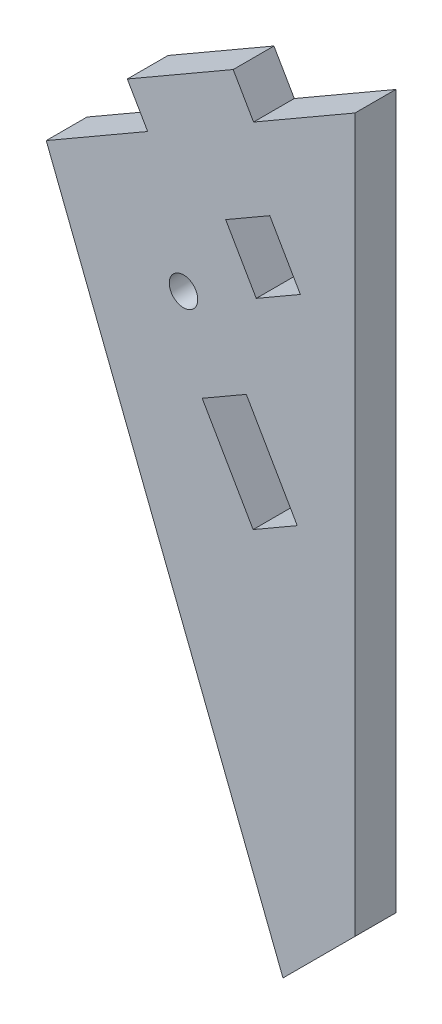
ISO-10303-21;
HEADER;
FILE_DESCRIPTION(('STEP AP214'),'2;1');
FILE_NAME('part.step','',(''),(''),'','','');
FILE_SCHEMA(('AUTOMOTIVE_DESIGN { 1 0 10303 214 1 1 1 1 }'));
ENDSEC;
DATA;
#1=APPLICATION_CONTEXT('core data for automotive mechanical design processes');
#2=APPLICATION_PROTOCOL_DEFINITION('international standard','automotive_design',2000,#1);
#3=PRODUCT_CONTEXT('',#1,'mechanical');
#4=PRODUCT('Part','Part','',(#3));
#5=PRODUCT_RELATED_PRODUCT_CATEGORY('part','',(#4));
#6=PRODUCT_DEFINITION_FORMATION('','',#4);
#7=PRODUCT_DEFINITION_CONTEXT('part definition',#1,'design');
#8=PRODUCT_DEFINITION('design','',#6,#7);
#9=PRODUCT_DEFINITION_SHAPE('','',#8);
#10=(LENGTH_UNIT() NAMED_UNIT(*) SI_UNIT(.MILLI.,.METRE.));
#11=(NAMED_UNIT(*) PLANE_ANGLE_UNIT() SI_UNIT($,.RADIAN.));
#12=(NAMED_UNIT(*) SI_UNIT($,.STERADIAN.) SOLID_ANGLE_UNIT());
#13=UNCERTAINTY_MEASURE_WITH_UNIT(LENGTH_MEASURE(1.E-05),#10,'distance_accuracy_value','');
#14=(GEOMETRIC_REPRESENTATION_CONTEXT(3) GLOBAL_UNCERTAINTY_ASSIGNED_CONTEXT((#13)) GLOBAL_UNIT_ASSIGNED_CONTEXT((#10,
#11,#12)) REPRESENTATION_CONTEXT('',''));
#15=CARTESIAN_POINT('',(0.,0.,0.));
#16=DIRECTION('',(0.,0.,1.));
#17=DIRECTION('',(1.,0.,0.));
#18=AXIS2_PLACEMENT_3D('',#15,#16,#17);
#19=CARTESIAN_POINT('',(0.,0.,4.));
#20=DIRECTION('',(0.,0.,-1.));
#21=DIRECTION('',(-1.,0.,0.));
#22=AXIS2_PLACEMENT_3D('',#19,#20,#21);
#23=PLANE('',#22);
#24=CARTESIAN_POINT('',(-1.68045223233763,11.4233839907486,4.));
#25=DIRECTION('',(0.,0.,-1.));
#26=DIRECTION('',(-1.,0.,0.));
#27=AXIS2_PLACEMENT_3D('',#24,#25,#26);
#28=CIRCLE('',#27,1.40000000000001);
#29=CARTESIAN_POINT('',(-3.08045223233765,11.4233839907486,4.));
#30=VERTEX_POINT('',#29);
#31=EDGE_CURVE('E165',#30,#30,#28,.T.);
#32=ORIENTED_EDGE('',*,*,#31,.T.);
#33=EDGE_LOOP('',(#32));
#34=FACE_BOUND('',#33,.T.);
#35=DIRECTION('',(0.5,-0.866025403784439,0.));
#36=VECTOR('',#35,1.);
#37=CARTESIAN_POINT('',(5.85119470179424,3.37818883616182,4.));
#38=LINE('',#37,#36);
#39=CARTESIAN_POINT('',(4.48461127712349,5.74518076047303,4.));
#40=VERTEX_POINT('',#39);
#41=CARTESIAN_POINT('',(9.48461127712348,-2.91507327737134,4.));
#42=VERTEX_POINT('',#41);
#43=EDGE_CURVE('E316',#40,#42,#38,.T.);
#44=ORIENTED_EDGE('',*,*,#43,.T.);
#45=DIRECTION('',(-0.866025403784439,-0.499999999999999,0.));
#46=VECTOR('',#45,1.);
#47=CARTESIAN_POINT('',(3.63341657532922,-6.29326211353315,4.));
#48=LINE('',#47,#46);
#49=CARTESIAN_POINT('',(5.15448425820127,-5.41507327737134,4.));
#50=VERTEX_POINT('',#49);
#51=EDGE_CURVE('E337',#42,#50,#48,.T.);
#52=ORIENTED_EDGE('',*,*,#51,.T.);
#53=DIRECTION('',(-0.499999999999998,0.86602540378444,0.));
#54=VECTOR('',#53,1.);
#55=CARTESIAN_POINT('',(1.52106768287205,0.878188836161813,4.));
#56=LINE('',#55,#54);
#57=CARTESIAN_POINT('',(0.15448425820129,3.24518076047306,4.));
#58=VERTEX_POINT('',#57);
#59=EDGE_CURVE('E333',#50,#58,#56,.T.);
#60=ORIENTED_EDGE('',*,*,#59,.T.);
#61=DIRECTION('',(0.866025403784441,0.499999999999996,0.));
#62=VECTOR('',#61,1.);
#63=CARTESIAN_POINT('',(-1.36658342467076,2.36699192431125,4.));
#64=LINE('',#63,#62);
#65=EDGE_CURVE('E329',#58,#40,#64,.T.);
#66=ORIENTED_EDGE('',*,*,#65,.T.);
#67=EDGE_LOOP('',(#44,#52,#60,#66));
#68=FACE_BOUND('',#67,.T.);
#69=DIRECTION('',(-0.499999999999998,0.86602540378444,0.));
#70=VECTOR('',#69,1.);
#71=CARTESIAN_POINT('',(10.3262235148383,5.96184792600409,4.));
#72=LINE('',#71,#70);
#73=CARTESIAN_POINT('',(5.45964009016751,14.3910176768065,4.));
#74=VERTEX_POINT('',#73);
#75=CARTESIAN_POINT('',(2.45964009016752,19.5871700995131,4.));
#76=VERTEX_POINT('',#75);
#77=EDGE_CURVE('E272',#74,#76,#72,.T.);
#78=ORIENTED_EDGE('',*,*,#77,.T.);
#79=DIRECTION('',(0.866025403784439,0.499999999999999,0.));
#80=VECTOR('',#79,1.);
#81=CARTESIAN_POINT('',(-7.86658342467077,13.625322173509,4.));
#82=LINE('',#81,#80);
#83=CARTESIAN_POINT('',(6.78976710908971,22.0871700995131,4.));
#84=VERTEX_POINT('',#83);
#85=EDGE_CURVE('E293',#76,#84,#82,.T.);
#86=ORIENTED_EDGE('',*,*,#85,.T.);
#87=DIRECTION('',(0.500000000000001,-0.866025403784438,0.));
#88=VECTOR('',#87,1.);
#89=CARTESIAN_POINT('',(14.6563505337605,8.46184792600415,4.));
#90=LINE('',#89,#88);
#91=CARTESIAN_POINT('',(9.78976710908971,16.8910176768065,4.));
#92=VERTEX_POINT('',#91);
#93=EDGE_CURVE('E289',#84,#92,#90,.T.);
#94=ORIENTED_EDGE('',*,*,#93,.T.);
#95=DIRECTION('',(-0.866025403784439,-0.5,0.));
#96=VECTOR('',#95,1.);
#97=CARTESIAN_POINT('',(-4.86658342467078,8.42916975080234,4.));
#98=LINE('',#97,#96);
#99=EDGE_CURVE('E285',#92,#74,#98,.T.);
#100=ORIENTED_EDGE('',*,*,#99,.T.);
#101=EDGE_LOOP('',(#78,#86,#94,#100));
#102=FACE_BOUND('',#101,.T.);
#103=DIRECTION('',(0.86602540378444,0.499999999999998,0.));
#104=VECTOR('',#103,1.);
#105=CARTESIAN_POINT('',(-7.19615242270664,26.7141016151379,4.));
#106=LINE('',#105,#104);
#107=CARTESIAN_POINT('',(-7.19615242270664,26.7141016151379,4.));
#108=VERTEX_POINT('',#107);
#109=CARTESIAN_POINT('',(3.19615242270663,32.7141016151378,4.));
#110=VERTEX_POINT('',#109);
#111=EDGE_CURVE('E156',#108,#110,#106,.T.);
#112=ORIENTED_EDGE('',*,*,#111,.F.);
#113=DIRECTION('',(0.499999999999998,-0.86602540378444,0.));
#114=VECTOR('',#113,1.);
#115=CARTESIAN_POINT('',(-7.69615242270663,27.5801270189223,4.));
#116=LINE('',#115,#114);
#117=CARTESIAN_POINT('',(-5.19615242270663,23.2500000000001,4.));
#118=VERTEX_POINT('',#117);
#119=EDGE_CURVE('E180',#108,#118,#116,.T.);
#120=ORIENTED_EDGE('',*,*,#119,.T.);
#121=DIRECTION('',(-0.86602540378444,-0.499999999999998,0.));
#122=VECTOR('',#121,1.);
#123=CARTESIAN_POINT('',(15.1554445662277,35.,4.));
#124=LINE('',#123,#122);
#125=CARTESIAN_POINT('',(-15.1554445662277,17.5000000000001,4.));
#126=VERTEX_POINT('',#125);
#127=EDGE_CURVE('E202',#118,#126,#124,.T.);
#128=ORIENTED_EDGE('',*,*,#127,.T.);
#129=DIRECTION('',(0.363441716985497,-0.9316169375632,0.));
#130=VECTOR('',#129,1.);
#131=CARTESIAN_POINT('',(8.08437675436215,-42.0710678118654,4.));
#132=LINE('',#131,#130);
#133=CARTESIAN_POINT('',(8.08437675436215,-42.0710678118654,4.));
#134=VERTEX_POINT('',#133);
#135=EDGE_CURVE('E228',#126,#134,#132,.T.);
#136=ORIENTED_EDGE('',*,*,#135,.T.);
#137=DIRECTION('',(0.707106781186556,0.707106781186539,0.));
#138=VECTOR('',#137,1.);
#139=CARTESIAN_POINT('',(15.1554445662277,-35.,4.));
#140=LINE('',#139,#138);
#141=CARTESIAN_POINT('',(15.1554445662277,-35.,4.));
#142=VERTEX_POINT('',#141);
#143=EDGE_CURVE('E251',#134,#142,#140,.T.);
#144=ORIENTED_EDGE('',*,*,#143,.T.);
#145=DIRECTION('',(0.,1.,0.));
#146=VECTOR('',#145,1.);
#147=CARTESIAN_POINT('',(15.1554445662277,35.,4.));
#148=LINE('',#147,#146);
#149=CARTESIAN_POINT('',(15.1554445662277,35.,4.));
#150=VERTEX_POINT('',#149);
#151=EDGE_CURVE('E199',#142,#150,#148,.T.);
#152=ORIENTED_EDGE('',*,*,#151,.T.);
#153=CARTESIAN_POINT('',(5.19615242270664,29.25,4.));
#154=VERTEX_POINT('',#153);
#155=EDGE_CURVE('E178',#150,#154,#124,.T.);
#156=ORIENTED_EDGE('',*,*,#155,.T.);
#157=DIRECTION('',(0.499999999999998,-0.86602540378444,0.));
#158=VECTOR('',#157,1.);
#159=CARTESIAN_POINT('',(2.69615242270664,33.5801270189223,4.));
#160=LINE('',#159,#158);
#161=EDGE_CURVE('E171',#110,#154,#160,.T.);
#162=ORIENTED_EDGE('',*,*,#161,.F.);
#163=EDGE_LOOP('',(#112,#120,#128,#136,#144,#152,#156,#162));
#164=FACE_BOUND('',#163,.T.);
#165=ADVANCED_FACE('F44',(#34,#68,#102,#164),#23,.F.);
#166=CARTESIAN_POINT('',(0.,0.,0.));
#167=DIRECTION('',(0.,0.,-1.));
#168=DIRECTION('',(-1.,0.,0.));
#169=AXIS2_PLACEMENT_3D('',#166,#167,#168);
#170=PLANE('',#169);
#171=CARTESIAN_POINT('',(-1.68045223233763,11.4233839907486,0.));
#172=DIRECTION('',(0.,0.,-1.));
#173=DIRECTION('',(-1.,0.,0.));
#174=AXIS2_PLACEMENT_3D('',#171,#172,#173);
#175=CIRCLE('',#174,1.40000000000001);
#176=CARTESIAN_POINT('',(-3.08045223233765,11.4233839907486,0.));
#177=VERTEX_POINT('',#176);
#178=EDGE_CURVE('E423',#177,#177,#175,.T.);
#179=ORIENTED_EDGE('',*,*,#178,.F.);
#180=EDGE_LOOP('',(#179));
#181=FACE_BOUND('',#180,.T.);
#182=DIRECTION('',(-0.866025403784439,-0.499999999999999,0.));
#183=VECTOR('',#182,1.);
#184=CARTESIAN_POINT('',(6.78976710908971,22.0871700995131,0.));
#185=LINE('',#184,#183);
#186=CARTESIAN_POINT('',(6.78976710908971,22.0871700995131,0.));
#187=VERTEX_POINT('',#186);
#188=CARTESIAN_POINT('',(2.45964009016753,19.5871700995131,0.));
#189=VERTEX_POINT('',#188);
#190=EDGE_CURVE('E252',#187,#189,#185,.T.);
#191=ORIENTED_EDGE('',*,*,#190,.T.);
#192=DIRECTION('',(0.499999999999998,-0.86602540378444,0.));
#193=VECTOR('',#192,1.);
#194=CARTESIAN_POINT('',(2.45964009016753,19.5871700995131,0.));
#195=LINE('',#194,#193);
#196=CARTESIAN_POINT('',(5.45964009016751,14.3910176768065,0.));
#197=VERTEX_POINT('',#196);
#198=EDGE_CURVE('E256',#189,#197,#195,.T.);
#199=ORIENTED_EDGE('',*,*,#198,.T.);
#200=DIRECTION('',(0.866025403784439,0.5,0.));
#201=VECTOR('',#200,1.);
#202=CARTESIAN_POINT('',(5.45964009016751,14.3910176768065,0.));
#203=LINE('',#202,#201);
#204=CARTESIAN_POINT('',(9.78976710908971,16.8910176768065,0.));
#205=VERTEX_POINT('',#204);
#206=EDGE_CURVE('E260',#197,#205,#203,.T.);
#207=ORIENTED_EDGE('',*,*,#206,.T.);
#208=DIRECTION('',(-0.500000000000001,0.866025403784438,0.));
#209=VECTOR('',#208,1.);
#210=CARTESIAN_POINT('',(9.78976710908971,16.8910176768065,0.));
#211=LINE('',#210,#209);
#212=EDGE_CURVE('E264',#205,#187,#211,.T.);
#213=ORIENTED_EDGE('',*,*,#212,.T.);
#214=EDGE_LOOP('',(#191,#199,#207,#213));
#215=FACE_BOUND('',#214,.T.);
#216=DIRECTION('',(0.866025403784439,0.499999999999999,0.));
#217=VECTOR('',#216,1.);
#218=CARTESIAN_POINT('',(5.15448425820127,-5.41507327737134,0.));
#219=LINE('',#218,#217);
#220=CARTESIAN_POINT('',(5.15448425820127,-5.41507327737134,0.));
#221=VERTEX_POINT('',#220);
#222=CARTESIAN_POINT('',(9.48461127712348,-2.91507327737134,0.));
#223=VERTEX_POINT('',#222);
#224=EDGE_CURVE('E296',#221,#223,#219,.T.);
#225=ORIENTED_EDGE('',*,*,#224,.T.);
#226=DIRECTION('',(-0.5,0.866025403784439,0.));
#227=VECTOR('',#226,1.);
#228=CARTESIAN_POINT('',(9.48461127712348,-2.91507327737134,0.));
#229=LINE('',#228,#227);
#230=CARTESIAN_POINT('',(4.48461127712349,5.74518076047303,0.));
#231=VERTEX_POINT('',#230);
#232=EDGE_CURVE('E300',#223,#231,#229,.T.);
#233=ORIENTED_EDGE('',*,*,#232,.T.);
#234=DIRECTION('',(-0.866025403784441,-0.499999999999996,0.));
#235=VECTOR('',#234,1.);
#236=CARTESIAN_POINT('',(4.48461127712349,5.74518076047303,0.));
#237=LINE('',#236,#235);
#238=CARTESIAN_POINT('',(0.15448425820129,3.24518076047306,0.));
#239=VERTEX_POINT('',#238);
#240=EDGE_CURVE('E304',#231,#239,#237,.T.);
#241=ORIENTED_EDGE('',*,*,#240,.T.);
#242=DIRECTION('',(0.499999999999998,-0.86602540378444,0.));
#243=VECTOR('',#242,1.);
#244=CARTESIAN_POINT('',(0.15448425820129,3.24518076047306,0.));
#245=LINE('',#244,#243);
#246=EDGE_CURVE('E308',#239,#221,#245,.T.);
#247=ORIENTED_EDGE('',*,*,#246,.T.);
#248=EDGE_LOOP('',(#225,#233,#241,#247));
#249=FACE_BOUND('',#248,.T.);
#250=DIRECTION('',(0.499999999999998,-0.86602540378444,0.));
#251=VECTOR('',#250,1.);
#252=CARTESIAN_POINT('',(-7.69615242270663,27.5801270189223,0.));
#253=LINE('',#252,#251);
#254=CARTESIAN_POINT('',(-7.19615242270664,26.7141016151379,0.));
#255=VERTEX_POINT('',#254);
#256=CARTESIAN_POINT('',(-5.19615242270664,23.2500000000001,0.));
#257=VERTEX_POINT('',#256);
#258=EDGE_CURVE('E186',#255,#257,#253,.T.);
#259=ORIENTED_EDGE('',*,*,#258,.F.);
#260=DIRECTION('',(-0.86602540378444,-0.499999999999998,0.));
#261=VECTOR('',#260,1.);
#262=CARTESIAN_POINT('',(3.19615242270663,32.7141016151378,0.));
#263=LINE('',#262,#261);
#264=CARTESIAN_POINT('',(3.19615242270663,32.7141016151378,0.));
#265=VERTEX_POINT('',#264);
#266=EDGE_CURVE('E60',#265,#255,#263,.T.);
#267=ORIENTED_EDGE('',*,*,#266,.F.);
#268=DIRECTION('',(0.499999999999998,-0.86602540378444,0.));
#269=VECTOR('',#268,1.);
#270=CARTESIAN_POINT('',(2.69615242270664,33.5801270189223,0.));
#271=LINE('',#270,#269);
#272=CARTESIAN_POINT('',(5.19615242270664,29.25,0.));
#273=VERTEX_POINT('',#272);
#274=EDGE_CURVE('E173',#265,#273,#271,.T.);
#275=ORIENTED_EDGE('',*,*,#274,.T.);
#276=DIRECTION('',(-0.86602540378444,-0.499999999999998,0.));
#277=VECTOR('',#276,1.);
#278=CARTESIAN_POINT('',(15.1554445662277,35.,0.));
#279=LINE('',#278,#277);
#280=CARTESIAN_POINT('',(15.1554445662277,35.,0.));
#281=VERTEX_POINT('',#280);
#282=EDGE_CURVE('E203',#281,#273,#279,.T.);
#283=ORIENTED_EDGE('',*,*,#282,.F.);
#284=DIRECTION('',(0.,1.,0.));
#285=VECTOR('',#284,1.);
#286=CARTESIAN_POINT('',(15.1554445662277,35.,0.));
#287=LINE('',#286,#285);
#288=CARTESIAN_POINT('',(15.1554445662277,-35.,0.));
#289=VERTEX_POINT('',#288);
#290=EDGE_CURVE('E198',#289,#281,#287,.T.);
#291=ORIENTED_EDGE('',*,*,#290,.F.);
#292=DIRECTION('',(-0.707106781186556,-0.707106781186539,0.));
#293=VECTOR('',#292,1.);
#294=CARTESIAN_POINT('',(15.1554445662277,-35.,0.));
#295=LINE('',#294,#293);
#296=CARTESIAN_POINT('',(8.08437675436215,-42.0710678118654,0.));
#297=VERTEX_POINT('',#296);
#298=EDGE_CURVE('E237',#289,#297,#295,.T.);
#299=ORIENTED_EDGE('',*,*,#298,.T.);
#300=DIRECTION('',(-0.363441716985497,0.9316169375632,0.));
#301=VECTOR('',#300,1.);
#302=CARTESIAN_POINT('',(8.08437675436215,-42.0710678118654,0.));
#303=LINE('',#302,#301);
#304=CARTESIAN_POINT('',(-15.1554445662277,17.5000000000001,0.));
#305=VERTEX_POINT('',#304);
#306=EDGE_CURVE('E226',#297,#305,#303,.T.);
#307=ORIENTED_EDGE('',*,*,#306,.T.);
#308=EDGE_CURVE('E210',#257,#305,#279,.T.);
#309=ORIENTED_EDGE('',*,*,#308,.F.);
#310=EDGE_LOOP('',(#259,#267,#275,#283,#291,#299,#307,#309));
#311=FACE_BOUND('',#310,.T.);
#312=ADVANCED_FACE('F234',(#181,#215,#249,#311),#170,.T.);
#313=CARTESIAN_POINT('',(2.69615242270664,33.5801270189223,0.));
#314=DIRECTION('',(0.86602540378444,0.499999999999998,0.));
#315=DIRECTION('',(-0.499999999999998,0.86602540378444,0.));
#316=AXIS2_PLACEMENT_3D('',#313,#314,#315);
#317=PLANE('',#316);
#318=ORIENTED_EDGE('',*,*,#274,.F.);
#319=DIRECTION('',(0.,0.,-1.));
#320=VECTOR('',#319,1.);
#321=CARTESIAN_POINT('',(3.19615242270663,32.7141016151378,4.));
#322=LINE('',#321,#320);
#323=EDGE_CURVE('E159',#110,#265,#322,.T.);
#324=ORIENTED_EDGE('',*,*,#323,.F.);
#325=ORIENTED_EDGE('',*,*,#161,.T.);
#326=DIRECTION('',(0.,0.,1.));
#327=VECTOR('',#326,1.);
#328=CARTESIAN_POINT('',(5.19615242270663,29.2500000000001,0.));
#329=LINE('',#328,#327);
#330=EDGE_CURVE('E190',#273,#154,#329,.T.);
#331=ORIENTED_EDGE('',*,*,#330,.F.);
#332=EDGE_LOOP('',(#318,#324,#325,#331));
#333=FACE_BOUND('',#332,.T.);
#334=ADVANCED_FACE('F169',(#333),#317,.T.);
#335=CARTESIAN_POINT('',(-7.69615242270663,27.5801270189223,0.));
#336=DIRECTION('',(-0.86602540378444,-0.499999999999998,0.));
#337=DIRECTION('',(0.499999999999998,-0.86602540378444,0.));
#338=AXIS2_PLACEMENT_3D('',#335,#336,#337);
#339=PLANE('',#338);
#340=ORIENTED_EDGE('',*,*,#119,.F.);
#341=DIRECTION('',(0.,0.,1.));
#342=VECTOR('',#341,1.);
#343=CARTESIAN_POINT('',(-7.19615242270664,26.7141016151379,0.));
#344=LINE('',#343,#342);
#345=EDGE_CURVE('E160',#255,#108,#344,.T.);
#346=ORIENTED_EDGE('',*,*,#345,.F.);
#347=ORIENTED_EDGE('',*,*,#258,.T.);
#348=DIRECTION('',(0.,0.,-1.));
#349=VECTOR('',#348,1.);
#350=CARTESIAN_POINT('',(-5.19615242270664,23.2500000000001,0.));
#351=LINE('',#350,#349);
#352=EDGE_CURVE('E181',#118,#257,#351,.T.);
#353=ORIENTED_EDGE('',*,*,#352,.F.);
#354=EDGE_LOOP('',(#340,#346,#347,#353));
#355=FACE_BOUND('',#354,.T.);
#356=ADVANCED_FACE('F361',(#355),#339,.T.);
#357=CARTESIAN_POINT('',(15.1554445662277,35.,4.));
#358=DIRECTION('',(0.499999999999998,-0.86602540378444,0.));
#359=DIRECTION('',(0.86602540378444,0.499999999999998,0.));
#360=AXIS2_PLACEMENT_3D('',#357,#358,#359);
#361=PLANE('',#360);
#362=ORIENTED_EDGE('',*,*,#282,.T.);
#363=ORIENTED_EDGE('',*,*,#330,.T.);
#364=ORIENTED_EDGE('',*,*,#155,.F.);
#365=DIRECTION('',(0.,0.,-1.));
#366=VECTOR('',#365,1.);
#367=CARTESIAN_POINT('',(15.1554445662277,35.,4.));
#368=LINE('',#367,#366);
#369=EDGE_CURVE('E11',#150,#281,#368,.T.);
#370=ORIENTED_EDGE('',*,*,#369,.T.);
#371=EDGE_LOOP('',(#362,#363,#364,#370));
#372=FACE_BOUND('',#371,.T.);
#373=ADVANCED_FACE('F342',(#372),#361,.F.);
#374=CARTESIAN_POINT('',(15.1554445662277,35.,4.));
#375=DIRECTION('',(-1.,0.,0.));
#376=DIRECTION('',(0.,0.,1.));
#377=AXIS2_PLACEMENT_3D('',#374,#375,#376);
#378=PLANE('',#377);
#379=ORIENTED_EDGE('',*,*,#290,.T.);
#380=ORIENTED_EDGE('',*,*,#369,.F.);
#381=ORIENTED_EDGE('',*,*,#151,.F.);
#382=DIRECTION('',(0.,0.,-1.));
#383=VECTOR('',#382,1.);
#384=CARTESIAN_POINT('',(15.1554445662277,-35.,4.));
#385=LINE('',#384,#383);
#386=EDGE_CURVE('E206',#142,#289,#385,.T.);
#387=ORIENTED_EDGE('',*,*,#386,.T.);
#388=EDGE_LOOP('',(#379,#380,#381,#387));
#389=FACE_BOUND('',#388,.T.);
#390=ADVANCED_FACE('F46',(#389),#378,.F.);
#391=ORIENTED_EDGE('',*,*,#127,.F.);
#392=ORIENTED_EDGE('',*,*,#352,.T.);
#393=ORIENTED_EDGE('',*,*,#308,.T.);
#394=DIRECTION('',(0.,0.,-1.));
#395=VECTOR('',#394,1.);
#396=CARTESIAN_POINT('',(-15.1554445662277,17.5000000000001,4.));
#397=LINE('',#396,#395);
#398=EDGE_CURVE('E53',#126,#305,#397,.T.);
#399=ORIENTED_EDGE('',*,*,#398,.F.);
#400=EDGE_LOOP('',(#391,#392,#393,#399));
#401=FACE_BOUND('',#400,.T.);
#402=ADVANCED_FACE('F355',(#401),#361,.F.);
#403=CARTESIAN_POINT('',(5.15448425820127,-5.41507327737134,0.));
#404=DIRECTION('',(0.499999999999999,-0.866025403784439,0.));
#405=DIRECTION('',(0.866025403784439,0.499999999999999,0.));
#406=AXIS2_PLACEMENT_3D('',#403,#404,#405);
#407=PLANE('',#406);
#408=DIRECTION('',(0.,0.,1.));
#409=VECTOR('',#408,1.);
#410=CARTESIAN_POINT('',(9.48461127712348,-2.91507327737134,0.));
#411=LINE('',#410,#409);
#412=EDGE_CURVE('E311',#223,#42,#411,.T.);
#413=ORIENTED_EDGE('',*,*,#412,.F.);
#414=ORIENTED_EDGE('',*,*,#224,.F.);
#415=DIRECTION('',(0.,0.,1.));
#416=VECTOR('',#415,1.);
#417=CARTESIAN_POINT('',(5.15448425820127,-5.41507327737134,0.));
#418=LINE('',#417,#416);
#419=EDGE_CURVE('E312',#221,#50,#418,.T.);
#420=ORIENTED_EDGE('',*,*,#419,.T.);
#421=ORIENTED_EDGE('',*,*,#51,.F.);
#422=EDGE_LOOP('',(#413,#414,#420,#421));
#423=FACE_BOUND('',#422,.T.);
#424=ADVANCED_FACE('F360',(#423),#407,.F.);
#425=CARTESIAN_POINT('',(0.15448425820129,3.24518076047306,0.));
#426=DIRECTION('',(-0.86602540378444,-0.499999999999998,0.));
#427=DIRECTION('',(0.499999999999998,-0.86602540378444,0.));
#428=AXIS2_PLACEMENT_3D('',#425,#426,#427);
#429=PLANE('',#428);
#430=ORIENTED_EDGE('',*,*,#419,.F.);
#431=ORIENTED_EDGE('',*,*,#246,.F.);
#432=DIRECTION('',(0.,0.,1.));
#433=VECTOR('',#432,1.);
#434=CARTESIAN_POINT('',(0.15448425820129,3.24518076047306,0.));
#435=LINE('',#434,#433);
#436=EDGE_CURVE('E317',#239,#58,#435,.T.);
#437=ORIENTED_EDGE('',*,*,#436,.T.);
#438=ORIENTED_EDGE('',*,*,#59,.F.);
#439=EDGE_LOOP('',(#430,#431,#437,#438));
#440=FACE_BOUND('',#439,.T.);
#441=ADVANCED_FACE('F380',(#440),#429,.F.);
#442=CARTESIAN_POINT('',(4.48461127712349,5.74518076047303,0.));
#443=DIRECTION('',(-0.499999999999996,0.866025403784441,0.));
#444=DIRECTION('',(-0.866025403784441,-0.499999999999996,0.));
#445=AXIS2_PLACEMENT_3D('',#442,#443,#444);
#446=PLANE('',#445);
#447=ORIENTED_EDGE('',*,*,#436,.F.);
#448=ORIENTED_EDGE('',*,*,#240,.F.);
#449=DIRECTION('',(0.,0.,1.));
#450=VECTOR('',#449,1.);
#451=CARTESIAN_POINT('',(4.48461127712349,5.74518076047303,0.));
#452=LINE('',#451,#450);
#453=EDGE_CURVE('E321',#231,#40,#452,.T.);
#454=ORIENTED_EDGE('',*,*,#453,.T.);
#455=ORIENTED_EDGE('',*,*,#65,.F.);
#456=EDGE_LOOP('',(#447,#448,#454,#455));
#457=FACE_BOUND('',#456,.T.);
#458=ADVANCED_FACE('F386',(#457),#446,.F.);
#459=CARTESIAN_POINT('',(9.48461127712348,-2.91507327737134,0.));
#460=DIRECTION('',(0.866025403784439,0.5,0.));
#461=DIRECTION('',(-0.5,0.866025403784439,0.));
#462=AXIS2_PLACEMENT_3D('',#459,#460,#461);
#463=PLANE('',#462);
#464=ORIENTED_EDGE('',*,*,#453,.F.);
#465=ORIENTED_EDGE('',*,*,#232,.F.);
#466=ORIENTED_EDGE('',*,*,#412,.T.);
#467=ORIENTED_EDGE('',*,*,#43,.F.);
#468=EDGE_LOOP('',(#464,#465,#466,#467));
#469=FACE_BOUND('',#468,.T.);
#470=ADVANCED_FACE('F382',(#469),#463,.F.);
#471=CARTESIAN_POINT('',(6.78976710908971,22.0871700995131,0.));
#472=DIRECTION('',(-0.499999999999999,0.866025403784439,0.));
#473=DIRECTION('',(-0.866025403784439,-0.499999999999999,0.));
#474=AXIS2_PLACEMENT_3D('',#471,#472,#473);
#475=PLANE('',#474);
#476=DIRECTION('',(0.,0.,1.));
#477=VECTOR('',#476,1.);
#478=CARTESIAN_POINT('',(2.45964009016753,19.5871700995131,0.));
#479=LINE('',#478,#477);
#480=EDGE_CURVE('E68',#189,#76,#479,.T.);
#481=ORIENTED_EDGE('',*,*,#480,.F.);
#482=ORIENTED_EDGE('',*,*,#190,.F.);
#483=DIRECTION('',(0.,0.,1.));
#484=VECTOR('',#483,1.);
#485=CARTESIAN_POINT('',(6.78976710908971,22.0871700995131,0.));
#486=LINE('',#485,#484);
#487=EDGE_CURVE('E268',#187,#84,#486,.T.);
#488=ORIENTED_EDGE('',*,*,#487,.T.);
#489=ORIENTED_EDGE('',*,*,#85,.F.);
#490=EDGE_LOOP('',(#481,#482,#488,#489));
#491=FACE_BOUND('',#490,.T.);
#492=ADVANCED_FACE('F385',(#491),#475,.F.);
#493=CARTESIAN_POINT('',(9.78976710908971,16.8910176768065,0.));
#494=DIRECTION('',(0.866025403784438,0.500000000000001,0.));
#495=DIRECTION('',(-0.500000000000001,0.866025403784438,0.));
#496=AXIS2_PLACEMENT_3D('',#493,#494,#495);
#497=PLANE('',#496);
#498=ORIENTED_EDGE('',*,*,#487,.F.);
#499=ORIENTED_EDGE('',*,*,#212,.F.);
#500=DIRECTION('',(0.,0.,1.));
#501=VECTOR('',#500,1.);
#502=CARTESIAN_POINT('',(9.78976710908971,16.8910176768065,0.));
#503=LINE('',#502,#501);
#504=EDGE_CURVE('E273',#205,#92,#503,.T.);
#505=ORIENTED_EDGE('',*,*,#504,.T.);
#506=ORIENTED_EDGE('',*,*,#93,.F.);
#507=EDGE_LOOP('',(#498,#499,#505,#506));
#508=FACE_BOUND('',#507,.T.);
#509=ADVANCED_FACE('F396',(#508),#497,.F.);
#510=CARTESIAN_POINT('',(5.45964009016751,14.3910176768065,0.));
#511=DIRECTION('',(0.5,-0.866025403784439,0.));
#512=DIRECTION('',(0.866025403784439,0.5,0.));
#513=AXIS2_PLACEMENT_3D('',#510,#511,#512);
#514=PLANE('',#513);
#515=ORIENTED_EDGE('',*,*,#504,.F.);
#516=ORIENTED_EDGE('',*,*,#206,.F.);
#517=DIRECTION('',(0.,0.,1.));
#518=VECTOR('',#517,1.);
#519=CARTESIAN_POINT('',(5.45964009016751,14.3910176768065,0.));
#520=LINE('',#519,#518);
#521=EDGE_CURVE('E277',#197,#74,#520,.T.);
#522=ORIENTED_EDGE('',*,*,#521,.T.);
#523=ORIENTED_EDGE('',*,*,#99,.F.);
#524=EDGE_LOOP('',(#515,#516,#522,#523));
#525=FACE_BOUND('',#524,.T.);
#526=ADVANCED_FACE('F401',(#525),#514,.F.);
#527=CARTESIAN_POINT('',(2.45964009016753,19.5871700995131,0.));
#528=DIRECTION('',(-0.86602540378444,-0.499999999999998,0.));
#529=DIRECTION('',(0.499999999999998,-0.86602540378444,0.));
#530=AXIS2_PLACEMENT_3D('',#527,#528,#529);
#531=PLANE('',#530);
#532=ORIENTED_EDGE('',*,*,#521,.F.);
#533=ORIENTED_EDGE('',*,*,#198,.F.);
#534=ORIENTED_EDGE('',*,*,#480,.T.);
#535=ORIENTED_EDGE('',*,*,#77,.F.);
#536=EDGE_LOOP('',(#532,#533,#534,#535));
#537=FACE_BOUND('',#536,.T.);
#538=ADVANCED_FACE('F398',(#537),#531,.F.);
#539=CARTESIAN_POINT('',(8.08437675436215,-42.0710678118654,70.8390762970725));
#540=DIRECTION('',(-0.9316169375632,-0.363441716985497,0.));
#541=DIRECTION('',(0.363441716985497,-0.9316169375632,0.));
#542=AXIS2_PLACEMENT_3D('',#539,#540,#541);
#543=PLANE('',#542);
#544=ORIENTED_EDGE('',*,*,#135,.F.);
#545=ORIENTED_EDGE('',*,*,#398,.T.);
#546=ORIENTED_EDGE('',*,*,#306,.F.);
#547=DIRECTION('',(0.,0.,-1.));
#548=VECTOR('',#547,1.);
#549=CARTESIAN_POINT('',(8.08437675436215,-42.0710678118654,70.8390762970725));
#550=LINE('',#549,#548);
#551=EDGE_CURVE('E242',#134,#297,#550,.T.);
#552=ORIENTED_EDGE('',*,*,#551,.F.);
#553=EDGE_LOOP('',(#544,#545,#546,#552));
#554=FACE_BOUND('',#553,.T.);
#555=ADVANCED_FACE('F224',(#554),#543,.T.);
#556=CARTESIAN_POINT('',(15.1554445662277,-35.,70.8390762970725));
#557=DIRECTION('',(0.707106781186539,-0.707106781186556,0.));
#558=DIRECTION('',(0.707106781186556,0.707106781186539,0.));
#559=AXIS2_PLACEMENT_3D('',#556,#557,#558);
#560=PLANE('',#559);
#561=ORIENTED_EDGE('',*,*,#143,.F.);
#562=ORIENTED_EDGE('',*,*,#551,.T.);
#563=ORIENTED_EDGE('',*,*,#298,.F.);
#564=ORIENTED_EDGE('',*,*,#386,.F.);
#565=EDGE_LOOP('',(#561,#562,#563,#564));
#566=FACE_BOUND('',#565,.T.);
#567=ADVANCED_FACE('F352',(#566),#560,.T.);
#568=CARTESIAN_POINT('',(-13.3665834246708,23.1516016151379,0.));
#569=DIRECTION('',(-0.499999999999998,0.86602540378444,0.));
#570=DIRECTION('',(-0.86602540378444,-0.499999999999998,0.));
#571=AXIS2_PLACEMENT_3D('',#568,#569,#570);
#572=PLANE('',#571);
#573=ORIENTED_EDGE('',*,*,#111,.T.);
#574=ORIENTED_EDGE('',*,*,#323,.T.);
#575=ORIENTED_EDGE('',*,*,#266,.T.);
#576=ORIENTED_EDGE('',*,*,#345,.T.);
#577=EDGE_LOOP('',(#573,#574,#575,#576));
#578=FACE_BOUND('',#577,.T.);
#579=ADVANCED_FACE('F158',(#578),#572,.T.);
#580=CARTESIAN_POINT('',(-1.68045223233763,11.4233839907486,4.));
#581=DIRECTION('',(0.,0.,-1.));
#582=DIRECTION('',(-1.,0.,0.));
#583=AXIS2_PLACEMENT_3D('',#580,#581,#582);
#584=CYLINDRICAL_SURFACE('',#583,1.40000000000001);
#585=ORIENTED_EDGE('',*,*,#31,.F.);
#586=EDGE_LOOP('',(#585));
#587=FACE_BOUND('',#586,.T.);
#588=ORIENTED_EDGE('',*,*,#178,.T.);
#589=EDGE_LOOP('',(#588));
#590=FACE_BOUND('',#589,.T.);
#591=ADVANCED_FACE('F414',(#587,#590),#584,.F.);
#592=CLOSED_SHELL('',(#165,#312,#334,#356,#373,#390,#402,#424,#441,#458,#470,#492,#509,#526,
#538,#555,#567,#579,#591));
#593=MANIFOLD_SOLID_BREP('B2',#592);
#594=ADVANCED_BREP_SHAPE_REPRESENTATION('',(#18,#593),#14);
#595=SHAPE_DEFINITION_REPRESENTATION(#9,#594);
ENDSEC;
END-ISO-10303-21;
